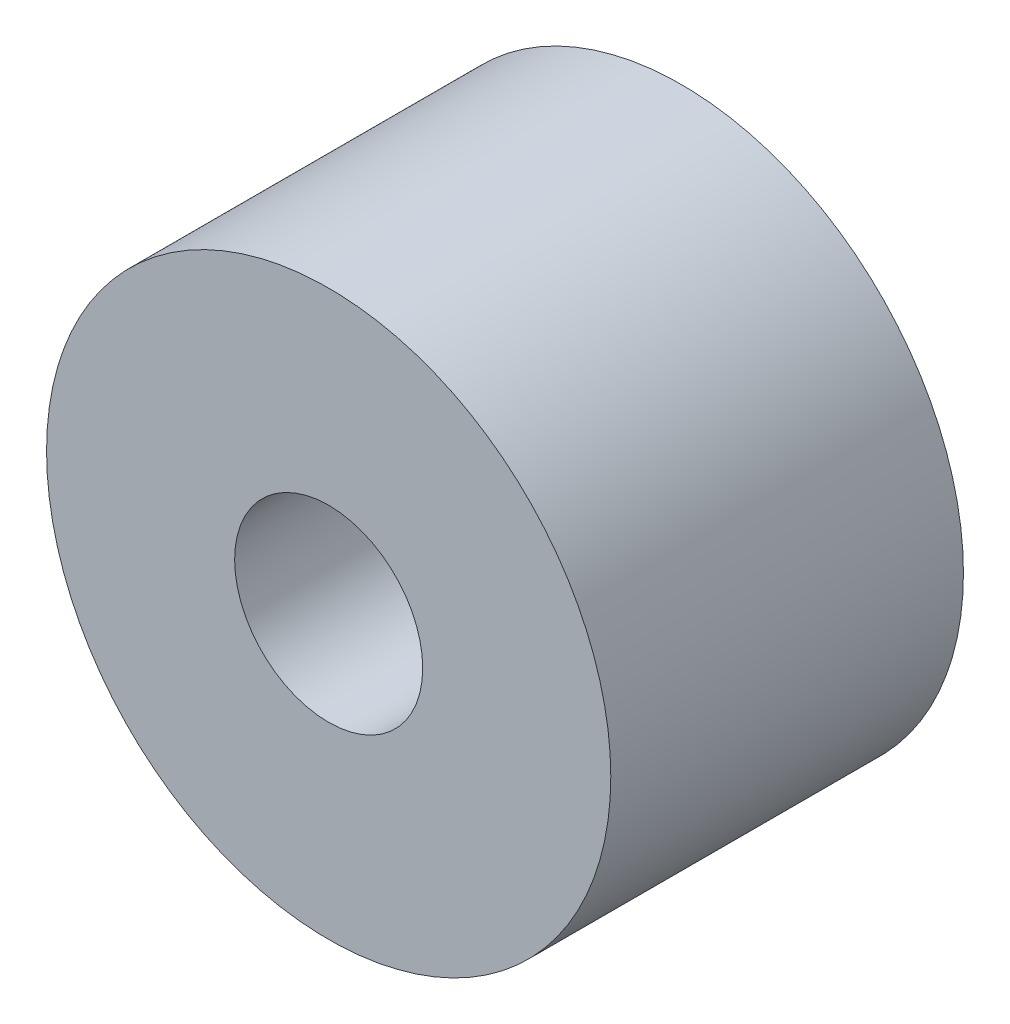
ISO-10303-21;
HEADER;
FILE_DESCRIPTION(('STEP AP214'),'2;1');
FILE_NAME('part.step','',(''),(''),'','','');
FILE_SCHEMA(('AUTOMOTIVE_DESIGN { 1 0 10303 214 1 1 1 1 }'));
ENDSEC;
DATA;
#1=APPLICATION_CONTEXT('core data for automotive mechanical design processes');
#2=APPLICATION_PROTOCOL_DEFINITION('international standard','automotive_design',2000,#1);
#3=PRODUCT_CONTEXT('',#1,'mechanical');
#4=PRODUCT('Part','Part','',(#3));
#5=PRODUCT_RELATED_PRODUCT_CATEGORY('part','',(#4));
#6=PRODUCT_DEFINITION_FORMATION('','',#4);
#7=PRODUCT_DEFINITION_CONTEXT('part definition',#1,'design');
#8=PRODUCT_DEFINITION('design','',#6,#7);
#9=PRODUCT_DEFINITION_SHAPE('','',#8);
#10=(LENGTH_UNIT() NAMED_UNIT(*) SI_UNIT(.MILLI.,.METRE.));
#11=(NAMED_UNIT(*) PLANE_ANGLE_UNIT() SI_UNIT($,.RADIAN.));
#12=(NAMED_UNIT(*) SI_UNIT($,.STERADIAN.) SOLID_ANGLE_UNIT());
#13=UNCERTAINTY_MEASURE_WITH_UNIT(LENGTH_MEASURE(1.E-05),#10,'distance_accuracy_value','');
#14=(GEOMETRIC_REPRESENTATION_CONTEXT(3) GLOBAL_UNCERTAINTY_ASSIGNED_CONTEXT((#13)) GLOBAL_UNIT_ASSIGNED_CONTEXT((#10,
#11,#12)) REPRESENTATION_CONTEXT('',''));
#15=CARTESIAN_POINT('',(0.,0.,0.));
#16=DIRECTION('',(0.,0.,1.));
#17=DIRECTION('',(1.,0.,0.));
#18=AXIS2_PLACEMENT_3D('',#15,#16,#17);
#19=CARTESIAN_POINT('',(0.,0.,15.));
#20=DIRECTION('',(0.,0.,-1.));
#21=DIRECTION('',(-1.,0.,0.));
#22=AXIS2_PLACEMENT_3D('',#19,#20,#21);
#23=CYLINDRICAL_SURFACE('',#22,12.);
#24=CARTESIAN_POINT('',(0.,0.,15.));
#25=DIRECTION('',(0.,0.,1.));
#26=DIRECTION('',(1.,0.,0.));
#27=AXIS2_PLACEMENT_3D('',#24,#25,#26);
#28=CIRCLE('',#27,12.);
#29=CARTESIAN_POINT('',(12.,0.,15.));
#30=VERTEX_POINT('',#29);
#31=EDGE_CURVE('E10',#30,#30,#28,.T.);
#32=ORIENTED_EDGE('',*,*,#31,.F.);
#33=EDGE_LOOP('',(#32));
#34=FACE_BOUND('',#33,.T.);
#35=CARTESIAN_POINT('',(0.,0.,0.));
#36=DIRECTION('',(0.,0.,1.));
#37=DIRECTION('',(1.,0.,0.));
#38=AXIS2_PLACEMENT_3D('',#35,#36,#37);
#39=CIRCLE('',#38,12.);
#40=CARTESIAN_POINT('',(12.,0.,0.));
#41=VERTEX_POINT('',#40);
#42=EDGE_CURVE('E45',#41,#41,#39,.T.);
#43=ORIENTED_EDGE('',*,*,#42,.T.);
#44=EDGE_LOOP('',(#43));
#45=FACE_BOUND('',#44,.T.);
#46=ADVANCED_FACE('F42',(#34,#45),#23,.T.);
#47=CARTESIAN_POINT('',(0.,0.,15.));
#48=DIRECTION('',(0.,0.,1.));
#49=DIRECTION('',(1.,0.,0.));
#50=AXIS2_PLACEMENT_3D('',#47,#48,#49);
#51=PLANE('',#50);
#52=CARTESIAN_POINT('',(0.,0.,15.));
#53=DIRECTION('',(0.,0.,1.));
#54=DIRECTION('',(1.,0.,0.));
#55=AXIS2_PLACEMENT_3D('',#52,#53,#54);
#56=CIRCLE('',#55,4.);
#57=CARTESIAN_POINT('',(4.,0.,15.));
#58=VERTEX_POINT('',#57);
#59=EDGE_CURVE('E54',#58,#58,#56,.T.);
#60=ORIENTED_EDGE('',*,*,#59,.F.);
#61=EDGE_LOOP('',(#60));
#62=FACE_BOUND('',#61,.T.);
#63=ORIENTED_EDGE('',*,*,#31,.T.);
#64=EDGE_LOOP('',(#63));
#65=FACE_BOUND('',#64,.T.);
#66=ADVANCED_FACE('F67',(#62,#65),#51,.T.);
#67=CARTESIAN_POINT('',(0.,0.,0.));
#68=DIRECTION('',(0.,0.,1.));
#69=DIRECTION('',(1.,0.,0.));
#70=AXIS2_PLACEMENT_3D('',#67,#68,#69);
#71=PLANE('',#70);
#72=CARTESIAN_POINT('',(0.,0.,0.));
#73=DIRECTION('',(0.,0.,1.));
#74=DIRECTION('',(1.,0.,0.));
#75=AXIS2_PLACEMENT_3D('',#72,#73,#74);
#76=CIRCLE('',#75,4.);
#77=CARTESIAN_POINT('',(4.,0.,0.));
#78=VERTEX_POINT('',#77);
#79=EDGE_CURVE('E56',#78,#78,#76,.T.);
#80=ORIENTED_EDGE('',*,*,#79,.T.);
#81=EDGE_LOOP('',(#80));
#82=FACE_BOUND('',#81,.T.);
#83=ORIENTED_EDGE('',*,*,#42,.F.);
#84=EDGE_LOOP('',(#83));
#85=FACE_BOUND('',#84,.T.);
#86=ADVANCED_FACE('F69',(#82,#85),#71,.F.);
#87=CARTESIAN_POINT('',(0.,0.,15.));
#88=DIRECTION('',(0.,0.,-1.));
#89=DIRECTION('',(-1.,0.,0.));
#90=AXIS2_PLACEMENT_3D('',#87,#88,#89);
#91=CYLINDRICAL_SURFACE('',#90,4.);
#92=ORIENTED_EDGE('',*,*,#59,.T.);
#93=EDGE_LOOP('',(#92));
#94=FACE_BOUND('',#93,.T.);
#95=ORIENTED_EDGE('',*,*,#79,.F.);
#96=EDGE_LOOP('',(#95));
#97=FACE_BOUND('',#96,.T.);
#98=ADVANCED_FACE('F64',(#94,#97),#91,.F.);
#99=CLOSED_SHELL('',(#46,#66,#86,#98));
#100=MANIFOLD_SOLID_BREP('B2',#99);
#101=ADVANCED_BREP_SHAPE_REPRESENTATION('',(#18,#100),#14);
#102=SHAPE_DEFINITION_REPRESENTATION(#9,#101);
ENDSEC;
END-ISO-10303-21;
